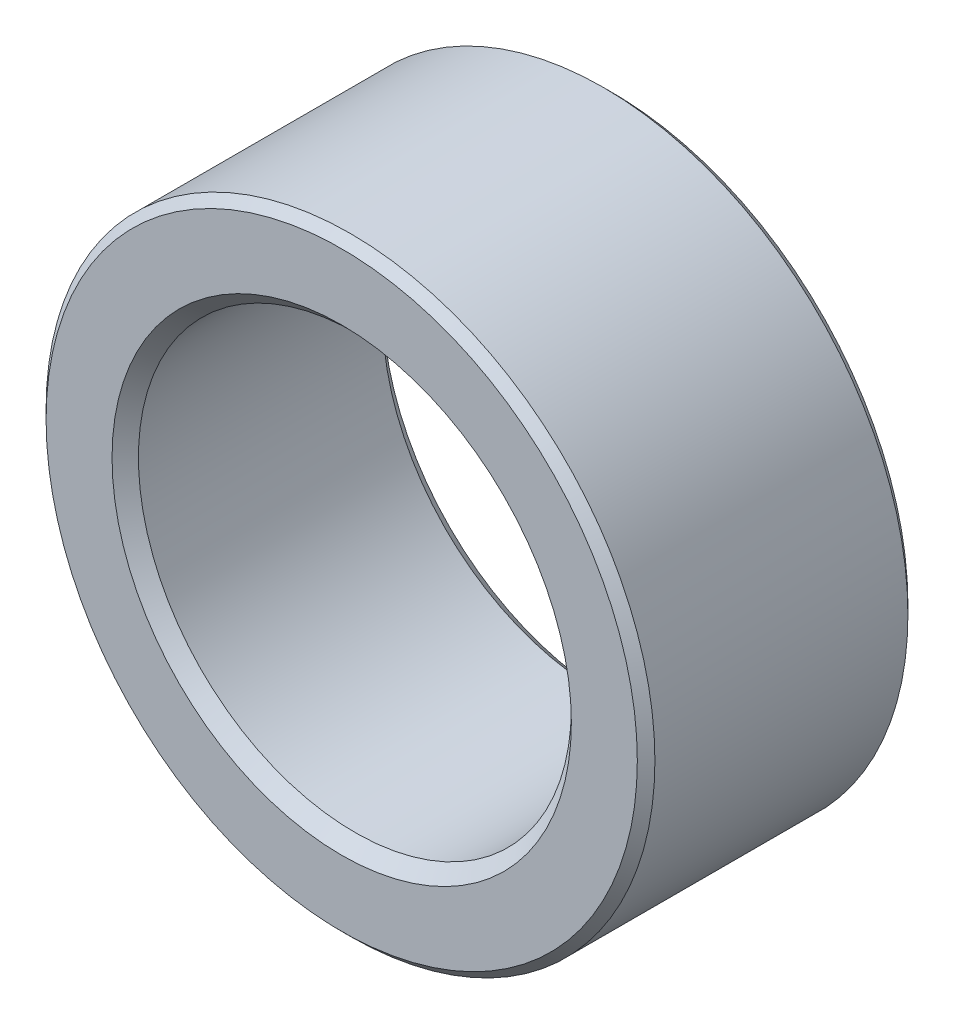
ISO-10303-21;
HEADER;
FILE_DESCRIPTION(('STEP AP214'),'2;1');
FILE_NAME('part.step','',(''),(''),'','','');
FILE_SCHEMA(('AUTOMOTIVE_DESIGN { 1 0 10303 214 1 1 1 1 }'));
ENDSEC;
DATA;
#1=APPLICATION_CONTEXT('core data for automotive mechanical design processes');
#2=APPLICATION_PROTOCOL_DEFINITION('international standard','automotive_design',2000,#1);
#3=PRODUCT_CONTEXT('',#1,'mechanical');
#4=PRODUCT('Part','Part','',(#3));
#5=PRODUCT_RELATED_PRODUCT_CATEGORY('part','',(#4));
#6=PRODUCT_DEFINITION_FORMATION('','',#4);
#7=PRODUCT_DEFINITION_CONTEXT('part definition',#1,'design');
#8=PRODUCT_DEFINITION('design','',#6,#7);
#9=PRODUCT_DEFINITION_SHAPE('','',#8);
#10=(LENGTH_UNIT() NAMED_UNIT(*) SI_UNIT(.MILLI.,.METRE.));
#11=(NAMED_UNIT(*) PLANE_ANGLE_UNIT() SI_UNIT($,.RADIAN.));
#12=(NAMED_UNIT(*) SI_UNIT($,.STERADIAN.) SOLID_ANGLE_UNIT());
#13=UNCERTAINTY_MEASURE_WITH_UNIT(LENGTH_MEASURE(1.E-05),#10,'distance_accuracy_value','');
#14=(GEOMETRIC_REPRESENTATION_CONTEXT(3) GLOBAL_UNCERTAINTY_ASSIGNED_CONTEXT((#13)) GLOBAL_UNIT_ASSIGNED_CONTEXT((#10,
#11,#12)) REPRESENTATION_CONTEXT('',''));
#15=CARTESIAN_POINT('',(0.,0.,0.));
#16=DIRECTION('',(0.,0.,1.));
#17=DIRECTION('',(1.,0.,0.));
#18=AXIS2_PLACEMENT_3D('',#15,#16,#17);
#19=CARTESIAN_POINT('',(0.,0.,-1.));
#20=DIRECTION('',(0.,0.,1.));
#21=DIRECTION('',(1.,0.,0.));
#22=AXIS2_PLACEMENT_3D('',#19,#20,#21);
#23=CYLINDRICAL_SURFACE('',#22,2.25);
#24=CARTESIAN_POINT('',(0.,0.,0.934999999999997));
#25=DIRECTION('',(0.,0.,1.));
#26=DIRECTION('',(1.,0.,0.));
#27=AXIS2_PLACEMENT_3D('',#24,#25,#26);
#28=CIRCLE('',#27,2.25);
#29=CARTESIAN_POINT('',(2.25,0.,0.934999999999997));
#30=VERTEX_POINT('',#29);
#31=EDGE_CURVE('E71',#30,#30,#28,.F.);
#32=ORIENTED_EDGE('',*,*,#31,.T.);
#33=EDGE_LOOP('',(#32));
#34=FACE_BOUND('',#33,.T.);
#35=CARTESIAN_POINT('',(0.,0.,-0.935000000000001));
#36=DIRECTION('',(0.,0.,1.));
#37=DIRECTION('',(1.,0.,0.));
#38=AXIS2_PLACEMENT_3D('',#35,#36,#37);
#39=CIRCLE('',#38,2.25);
#40=CARTESIAN_POINT('',(2.25,0.,-0.935000000000001));
#41=VERTEX_POINT('',#40);
#42=EDGE_CURVE('E75',#41,#41,#39,.T.);
#43=ORIENTED_EDGE('',*,*,#42,.T.);
#44=EDGE_LOOP('',(#43));
#45=FACE_BOUND('',#44,.T.);
#46=ADVANCED_FACE('F41',(#34,#45),#23,.T.);
#47=CARTESIAN_POINT('',(0.,0.,-1.));
#48=DIRECTION('',(0.,0.,1.));
#49=DIRECTION('',(1.,0.,0.));
#50=AXIS2_PLACEMENT_3D('',#47,#48,#49);
#51=PLANE('',#50);
#52=CARTESIAN_POINT('',(0.,0.,-1.));
#53=DIRECTION('',(0.,0.,1.));
#54=DIRECTION('',(1.,0.,0.));
#55=AXIS2_PLACEMENT_3D('',#52,#53,#54);
#56=CIRCLE('',#55,1.6975);
#57=CARTESIAN_POINT('',(1.6975,0.,-1.));
#58=VERTEX_POINT('',#57);
#59=EDGE_CURVE('E10',#58,#58,#56,.T.);
#60=ORIENTED_EDGE('',*,*,#59,.T.);
#61=EDGE_LOOP('',(#60));
#62=FACE_BOUND('',#61,.T.);
#63=CARTESIAN_POINT('',(0.,0.,-1.));
#64=DIRECTION('',(0.,0.,1.));
#65=DIRECTION('',(1.,0.,0.));
#66=AXIS2_PLACEMENT_3D('',#63,#64,#65);
#67=CIRCLE('',#66,2.185);
#68=CARTESIAN_POINT('',(2.185,0.,-1.));
#69=VERTEX_POINT('',#68);
#70=EDGE_CURVE('E67',#69,#69,#67,.F.);
#71=ORIENTED_EDGE('',*,*,#70,.T.);
#72=EDGE_LOOP('',(#71));
#73=FACE_BOUND('',#72,.T.);
#74=ADVANCED_FACE('F104',(#62,#73),#51,.F.);
#75=CARTESIAN_POINT('',(0.,0.,-1.));
#76=DIRECTION('',(0.,0.,1.));
#77=DIRECTION('',(1.,0.,0.));
#78=AXIS2_PLACEMENT_3D('',#75,#76,#77);
#79=CYLINDRICAL_SURFACE('',#78,1.6);
#80=CARTESIAN_POINT('',(0.,0.,0.902500000000001));
#81=DIRECTION('',(0.,0.,1.));
#82=DIRECTION('',(1.,0.,0.));
#83=AXIS2_PLACEMENT_3D('',#80,#81,#82);
#84=CIRCLE('',#83,1.6);
#85=CARTESIAN_POINT('',(1.6,0.,0.902500000000001));
#86=VERTEX_POINT('',#85);
#87=EDGE_CURVE('E55',#86,#86,#84,.T.);
#88=ORIENTED_EDGE('',*,*,#87,.T.);
#89=EDGE_LOOP('',(#88));
#90=FACE_BOUND('',#89,.T.);
#91=CARTESIAN_POINT('',(0.,0.,-0.9025));
#92=DIRECTION('',(0.,0.,1.));
#93=DIRECTION('',(1.,0.,0.));
#94=AXIS2_PLACEMENT_3D('',#91,#92,#93);
#95=CIRCLE('',#94,1.6);
#96=CARTESIAN_POINT('',(1.6,0.,-0.9025));
#97=VERTEX_POINT('',#96);
#98=EDGE_CURVE('E61',#97,#97,#95,.F.);
#99=ORIENTED_EDGE('',*,*,#98,.T.);
#100=EDGE_LOOP('',(#99));
#101=FACE_BOUND('',#100,.T.);
#102=ADVANCED_FACE('F99',(#90,#101),#79,.F.);
#103=CARTESIAN_POINT('',(0.,0.,1.));
#104=DIRECTION('',(0.,0.,1.));
#105=DIRECTION('',(1.,0.,0.));
#106=AXIS2_PLACEMENT_3D('',#103,#104,#105);
#107=PLANE('',#106);
#108=CARTESIAN_POINT('',(0.,0.,1.));
#109=DIRECTION('',(0.,0.,1.));
#110=DIRECTION('',(1.,0.,0.));
#111=AXIS2_PLACEMENT_3D('',#108,#109,#110);
#112=CIRCLE('',#111,1.6975);
#113=CARTESIAN_POINT('',(1.6975,0.,1.));
#114=VERTEX_POINT('',#113);
#115=EDGE_CURVE('E49',#114,#114,#112,.F.);
#116=ORIENTED_EDGE('',*,*,#115,.T.);
#117=EDGE_LOOP('',(#116));
#118=FACE_BOUND('',#117,.T.);
#119=CARTESIAN_POINT('',(0.,0.,1.));
#120=DIRECTION('',(0.,0.,1.));
#121=DIRECTION('',(1.,0.,0.));
#122=AXIS2_PLACEMENT_3D('',#119,#120,#121);
#123=CIRCLE('',#122,2.185);
#124=CARTESIAN_POINT('',(2.185,0.,1.));
#125=VERTEX_POINT('',#124);
#126=EDGE_CURVE('E79',#125,#125,#123,.T.);
#127=ORIENTED_EDGE('',*,*,#126,.T.);
#128=EDGE_LOOP('',(#127));
#129=FACE_BOUND('',#128,.T.);
#130=ADVANCED_FACE('F85',(#118,#129),#107,.T.);
#131=CARTESIAN_POINT('',(0.,0.,1.));
#132=DIRECTION('',(0.,0.,-1.));
#133=DIRECTION('',(-1.,0.,0.));
#134=AXIS2_PLACEMENT_3D('',#131,#132,#133);
#135=CONICAL_SURFACE('',#134,2.185,0.785398163397438);
#136=ORIENTED_EDGE('',*,*,#31,.F.);
#137=EDGE_LOOP('',(#136));
#138=FACE_BOUND('',#137,.T.);
#139=ORIENTED_EDGE('',*,*,#126,.F.);
#140=EDGE_LOOP('',(#139));
#141=FACE_BOUND('',#140,.T.);
#142=ADVANCED_FACE('F87',(#138,#141),#135,.T.);
#143=CARTESIAN_POINT('',(0.,0.,-0.935000000000001));
#144=DIRECTION('',(0.,0.,1.));
#145=DIRECTION('',(1.,0.,0.));
#146=AXIS2_PLACEMENT_3D('',#143,#144,#145);
#147=CONICAL_SURFACE('',#146,2.25,0.785398163397452);
#148=ORIENTED_EDGE('',*,*,#70,.F.);
#149=EDGE_LOOP('',(#148));
#150=FACE_BOUND('',#149,.T.);
#151=ORIENTED_EDGE('',*,*,#42,.F.);
#152=EDGE_LOOP('',(#151));
#153=FACE_BOUND('',#152,.T.);
#154=ADVANCED_FACE('F89',(#150,#153),#147,.T.);
#155=CARTESIAN_POINT('',(0.,0.,0.902500000000001));
#156=DIRECTION('',(0.,0.,1.));
#157=DIRECTION('',(1.,0.,0.));
#158=AXIS2_PLACEMENT_3D('',#155,#156,#157);
#159=CONICAL_SURFACE('',#158,1.6,0.785398163397454);
#160=CARTESIAN_POINT('',(1.6975,0.,1.));
#161=CARTESIAN_POINT('',(1.696484375,0.,0.998984375));
#162=CARTESIAN_POINT('',(1.69546875,0.,0.99796875));
#163=CARTESIAN_POINT('',(1.6934375,0.,0.9959375));
#164=CARTESIAN_POINT('',(1.692421875,0.,0.994921875));
#165=CARTESIAN_POINT('',(1.690390625,0.,0.992890625));
#166=CARTESIAN_POINT('',(1.689375,0.,0.991875));
#167=CARTESIAN_POINT('',(1.68734375,0.,0.98984375));
#168=CARTESIAN_POINT('',(1.686328125,0.,0.988828125));
#169=CARTESIAN_POINT('',(1.684296875,0.,0.986796875));
#170=CARTESIAN_POINT('',(1.68328125,0.,0.98578125));
#171=CARTESIAN_POINT('',(1.68125,0.,0.98375));
#172=CARTESIAN_POINT('',(1.680234375,0.,0.982734375));
#173=CARTESIAN_POINT('',(1.678203125,0.,0.980703125));
#174=CARTESIAN_POINT('',(1.6771875,0.,0.9796875));
#175=CARTESIAN_POINT('',(1.67515625,0.,0.97765625));
#176=CARTESIAN_POINT('',(1.674140625,0.,0.976640625));
#177=CARTESIAN_POINT('',(1.672109375,0.,0.974609375));
#178=CARTESIAN_POINT('',(1.67109375,0.,0.97359375));
#179=CARTESIAN_POINT('',(1.6690625,0.,0.9715625));
#180=CARTESIAN_POINT('',(1.668046875,0.,0.970546875));
#181=CARTESIAN_POINT('',(1.666015625,0.,0.968515625));
#182=CARTESIAN_POINT('',(1.665,0.,0.9675));
#183=CARTESIAN_POINT('',(1.66296875,0.,0.96546875));
#184=CARTESIAN_POINT('',(1.661953125,0.,0.964453125));
#185=CARTESIAN_POINT('',(1.659921875,0.,0.962421875));
#186=CARTESIAN_POINT('',(1.65890625,0.,0.96140625));
#187=CARTESIAN_POINT('',(1.656875,0.,0.959375));
#188=CARTESIAN_POINT('',(1.655859375,0.,0.958359375));
#189=CARTESIAN_POINT('',(1.653828125,0.,0.956328125));
#190=CARTESIAN_POINT('',(1.6528125,0.,0.9553125));
#191=CARTESIAN_POINT('',(1.65078125,0.,0.95328125));
#192=CARTESIAN_POINT('',(1.649765625,0.,0.952265625));
#193=CARTESIAN_POINT('',(1.647734375,0.,0.950234375));
#194=CARTESIAN_POINT('',(1.64671875,0.,0.94921875));
#195=CARTESIAN_POINT('',(1.6446875,0.,0.9471875));
#196=CARTESIAN_POINT('',(1.643671875,0.,0.946171875000001));
#197=CARTESIAN_POINT('',(1.641640625,0.,0.944140625));
#198=CARTESIAN_POINT('',(1.640625,0.,0.943125000000001));
#199=CARTESIAN_POINT('',(1.63859375,0.,0.941093750000001));
#200=CARTESIAN_POINT('',(1.637578125,0.,0.940078125));
#201=CARTESIAN_POINT('',(1.635546875,0.,0.938046875000001));
#202=CARTESIAN_POINT('',(1.63453125,0.,0.937031250000001));
#203=CARTESIAN_POINT('',(1.6325,0.,0.935000000000001));
#204=CARTESIAN_POINT('',(1.631484375,0.,0.933984375000001));
#205=CARTESIAN_POINT('',(1.629453125,0.,0.931953125000001));
#206=CARTESIAN_POINT('',(1.6284375,0.,0.930937500000001));
#207=CARTESIAN_POINT('',(1.62640625,0.,0.928906250000001));
#208=CARTESIAN_POINT('',(1.625390625,0.,0.927890625000001));
#209=CARTESIAN_POINT('',(1.623359375,0.,0.925859375000001));
#210=CARTESIAN_POINT('',(1.62234375,0.,0.924843750000001));
#211=CARTESIAN_POINT('',(1.6203125,0.,0.922812500000001));
#212=CARTESIAN_POINT('',(1.619296875,0.,0.921796875000001));
#213=CARTESIAN_POINT('',(1.617265625,0.,0.919765625000001));
#214=CARTESIAN_POINT('',(1.61625,0.,0.918750000000001));
#215=CARTESIAN_POINT('',(1.61421875,0.,0.916718750000001));
#216=CARTESIAN_POINT('',(1.613203125,0.,0.915703125000001));
#217=CARTESIAN_POINT('',(1.611171875,0.,0.913671875000001));
#218=CARTESIAN_POINT('',(1.61015625,0.,0.912656250000001));
#219=CARTESIAN_POINT('',(1.608125,0.,0.910625000000001));
#220=CARTESIAN_POINT('',(1.607109375,0.,0.909609375000001));
#221=CARTESIAN_POINT('',(1.605078125,0.,0.907578125000001));
#222=CARTESIAN_POINT('',(1.6040625,0.,0.906562500000001));
#223=CARTESIAN_POINT('',(1.60203125,0.,0.904531250000001));
#224=CARTESIAN_POINT('',(1.601015625,0.,0.903515625000001));
#225=CARTESIAN_POINT('',(1.6,0.,0.902500000000001));
#226=B_SPLINE_CURVE_WITH_KNOTS('',3,(#160,#161,#162,#163,#164,#165,#166,#167,#168,#169,#170,
#171,#172,#173,#174,#175,#176,#177,#178,#179,#180,#181,#182,#183,#184,#185,#186,#187,#188,#189,
#190,#191,#192,#193,#194,#195,#196,#197,#198,#199,#200,#201,#202,#203,#204,#205,#206,#207,#208,
#209,#210,#211,#212,#213,#214,#215,#216,#217,#218,#219,#220,#221,#222,#223,#224,#225),
.UNSPECIFIED.,.F.,.F.,(4,2,2,2,2,2,2,2,2,2,2,2,2,2,2,2,2,2,2,2,2,2,2,2,2,2,2,2,2,2,2,2,4),(0.,
0.00430893194785539,0.00861786389571093,0.0129267958435665,0.017235727791422,0.0215446597392775,
0.0258535916871329,0.0301625236349885,0.034471455582844,0.0387803875306996,0.043089319478555,
0.0473982514264106,0.051707183374266,0.0560161153221216,0.0603250472699771,0.0646339792178326,
0.0689429111656881,0.0732518431135436,0.0775607750613991,0.0818697070092547,0.0861786389571101,
0.0904875709049657,0.0947965028528211,0.0991054348006767,0.103414366748532,0.107723298696388,
0.112032230644243,0.116341162592099,0.120650094539954,0.12495902648781,0.129267958435665,
0.133576890383521,0.137885822331376),.UNSPECIFIED.);
#227=EDGE_CURVE('BSEAM96',#114,#86,#226,.T.);
#228=ORIENTED_EDGE('',*,*,#115,.F.);
#229=ORIENTED_EDGE('',*,*,#87,.F.);
#230=ORIENTED_EDGE('',*,*,#227,.T.);
#231=ORIENTED_EDGE('',*,*,#227,.F.);
#232=EDGE_LOOP('',(#228,#230,#229,#231));
#233=FACE_BOUND('',#232,.T.);
#234=ADVANCED_FACE('F96',(#233),#159,.F.);
#235=CARTESIAN_POINT('',(0.,0.,-1.));
#236=DIRECTION('',(0.,0.,-1.));
#237=DIRECTION('',(-1.,0.,0.));
#238=AXIS2_PLACEMENT_3D('',#235,#236,#237);
#239=CONICAL_SURFACE('',#238,1.6975,0.785398163397444);
#240=ORIENTED_EDGE('',*,*,#98,.F.);
#241=EDGE_LOOP('',(#240));
#242=FACE_BOUND('',#241,.T.);
#243=ORIENTED_EDGE('',*,*,#59,.F.);
#244=EDGE_LOOP('',(#243));
#245=FACE_BOUND('',#244,.T.);
#246=ADVANCED_FACE('F43',(#242,#245),#239,.F.);
#247=CLOSED_SHELL('',(#46,#74,#102,#130,#142,#154,#234,#246));
#248=MANIFOLD_SOLID_BREP('B2',#247);
#249=ADVANCED_BREP_SHAPE_REPRESENTATION('',(#18,#248),#14);
#250=SHAPE_DEFINITION_REPRESENTATION(#9,#249);
ENDSEC;
END-ISO-10303-21;
